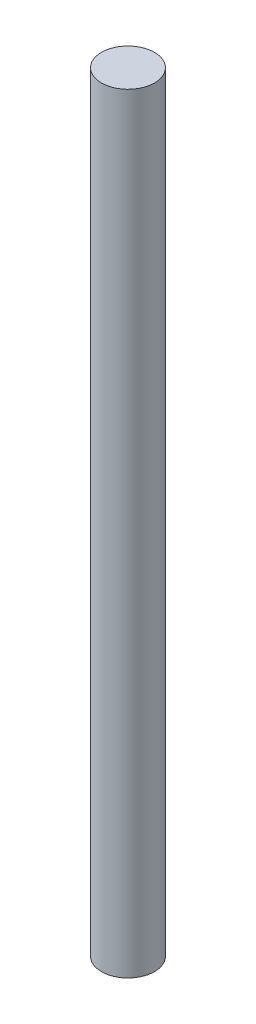
ISO-10303-21;
HEADER;
FILE_DESCRIPTION(('STEP AP214'),'2;1');
FILE_NAME('part.step','',(''),(''),'','','');
FILE_SCHEMA(('AUTOMOTIVE_DESIGN { 1 0 10303 214 1 1 1 1 }'));
ENDSEC;
DATA;
#1=APPLICATION_CONTEXT('core data for automotive mechanical design processes');
#2=APPLICATION_PROTOCOL_DEFINITION('international standard','automotive_design',2000,#1);
#3=PRODUCT_CONTEXT('',#1,'mechanical');
#4=PRODUCT('Part','Part','',(#3));
#5=PRODUCT_RELATED_PRODUCT_CATEGORY('part','',(#4));
#6=PRODUCT_DEFINITION_FORMATION('','',#4);
#7=PRODUCT_DEFINITION_CONTEXT('part definition',#1,'design');
#8=PRODUCT_DEFINITION('design','',#6,#7);
#9=PRODUCT_DEFINITION_SHAPE('','',#8);
#10=(LENGTH_UNIT() NAMED_UNIT(*) SI_UNIT(.MILLI.,.METRE.));
#11=(NAMED_UNIT(*) PLANE_ANGLE_UNIT() SI_UNIT($,.RADIAN.));
#12=(NAMED_UNIT(*) SI_UNIT($,.STERADIAN.) SOLID_ANGLE_UNIT());
#13=UNCERTAINTY_MEASURE_WITH_UNIT(LENGTH_MEASURE(1.E-05),#10,'distance_accuracy_value','');
#14=(GEOMETRIC_REPRESENTATION_CONTEXT(3) GLOBAL_UNCERTAINTY_ASSIGNED_CONTEXT((#13)) GLOBAL_UNIT_ASSIGNED_CONTEXT((#10,
#11,#12)) REPRESENTATION_CONTEXT('',''));
#15=CARTESIAN_POINT('',(0.,0.,0.));
#16=DIRECTION('',(0.,0.,1.));
#17=DIRECTION('',(1.,0.,0.));
#18=AXIS2_PLACEMENT_3D('',#15,#16,#17);
#19=CARTESIAN_POINT('',(0.,50.8,0.));
#20=DIRECTION('',(0.,-1.,0.));
#21=DIRECTION('',(0.,0.,-1.));
#22=AXIS2_PLACEMENT_3D('',#19,#20,#21);
#23=CYLINDRICAL_SURFACE('',#22,1.750000056);
#24=CARTESIAN_POINT('',(0.,50.8,0.));
#25=DIRECTION('',(0.,1.,0.));
#26=DIRECTION('',(0.,0.,1.));
#27=AXIS2_PLACEMENT_3D('',#24,#25,#26);
#28=CIRCLE('',#27,1.750000056);
#29=CARTESIAN_POINT('',(0.,50.8,1.750000056));
#30=VERTEX_POINT('',#29);
#31=EDGE_CURVE('E10',#30,#30,#28,.T.);
#32=ORIENTED_EDGE('',*,*,#31,.F.);
#33=EDGE_LOOP('',(#32));
#34=FACE_BOUND('',#33,.T.);
#35=CARTESIAN_POINT('',(0.,0.,0.));
#36=DIRECTION('',(0.,1.,0.));
#37=DIRECTION('',(0.,0.,1.));
#38=AXIS2_PLACEMENT_3D('',#35,#36,#37);
#39=CIRCLE('',#38,1.750000056);
#40=CARTESIAN_POINT('',(0.,0.,1.750000056));
#41=VERTEX_POINT('',#40);
#42=EDGE_CURVE('E46',#41,#41,#39,.T.);
#43=ORIENTED_EDGE('',*,*,#42,.T.);
#44=EDGE_LOOP('',(#43));
#45=FACE_BOUND('',#44,.T.);
#46=ADVANCED_FACE('F43',(#34,#45),#23,.T.);
#47=CARTESIAN_POINT('',(0.,50.8,0.));
#48=DIRECTION('',(0.,1.,0.));
#49=DIRECTION('',(0.,0.,1.));
#50=AXIS2_PLACEMENT_3D('',#47,#48,#49);
#51=PLANE('',#50);
#52=ORIENTED_EDGE('',*,*,#31,.T.);
#53=EDGE_LOOP('',(#52));
#54=FACE_BOUND('',#53,.T.);
#55=ADVANCED_FACE('F60',(#54),#51,.T.);
#56=CARTESIAN_POINT('',(0.,0.,0.));
#57=DIRECTION('',(0.,1.,0.));
#58=DIRECTION('',(0.,0.,1.));
#59=AXIS2_PLACEMENT_3D('',#56,#57,#58);
#60=PLANE('',#59);
#61=ORIENTED_EDGE('',*,*,#42,.F.);
#62=EDGE_LOOP('',(#61));
#63=FACE_BOUND('',#62,.T.);
#64=ADVANCED_FACE('F58',(#63),#60,.F.);
#65=CLOSED_SHELL('',(#46,#55,#64));
#66=MANIFOLD_SOLID_BREP('B2',#65);
#67=ADVANCED_BREP_SHAPE_REPRESENTATION('',(#18,#66),#14);
#68=SHAPE_DEFINITION_REPRESENTATION(#9,#67);
ENDSEC;
END-ISO-10303-21;
